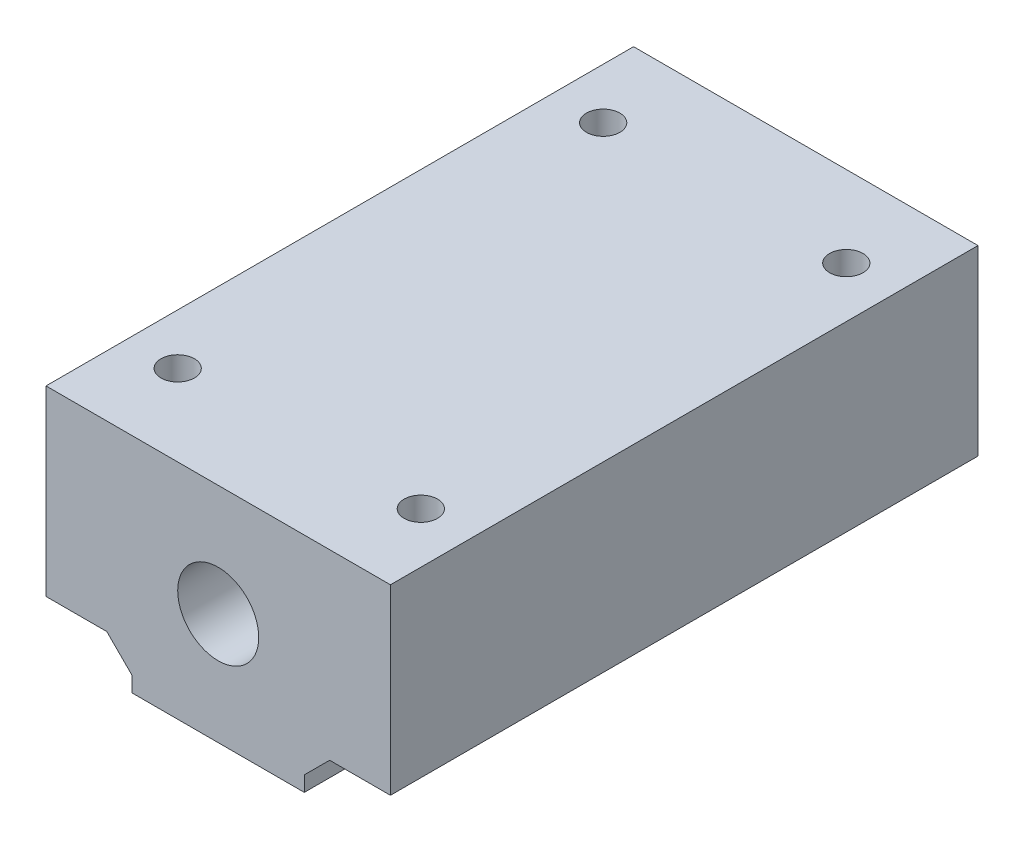
ISO-10303-21;
HEADER;
FILE_DESCRIPTION(('STEP AP214'),'2;1');
FILE_NAME('part.step','',(''),(''),'','','');
FILE_SCHEMA(('AUTOMOTIVE_DESIGN { 1 0 10303 214 1 1 1 1 }'));
ENDSEC;
DATA;
#1=APPLICATION_CONTEXT('core data for automotive mechanical design processes');
#2=APPLICATION_PROTOCOL_DEFINITION('international standard','automotive_design',2000,#1);
#3=PRODUCT_CONTEXT('',#1,'mechanical');
#4=PRODUCT('Part','Part','',(#3));
#5=PRODUCT_RELATED_PRODUCT_CATEGORY('part','',(#4));
#6=PRODUCT_DEFINITION_FORMATION('','',#4);
#7=PRODUCT_DEFINITION_CONTEXT('part definition',#1,'design');
#8=PRODUCT_DEFINITION('design','',#6,#7);
#9=PRODUCT_DEFINITION_SHAPE('','',#8);
#10=(LENGTH_UNIT() NAMED_UNIT(*) SI_UNIT(.MILLI.,.METRE.));
#11=(NAMED_UNIT(*) PLANE_ANGLE_UNIT() SI_UNIT($,.RADIAN.));
#12=(NAMED_UNIT(*) SI_UNIT($,.STERADIAN.) SOLID_ANGLE_UNIT());
#13=UNCERTAINTY_MEASURE_WITH_UNIT(LENGTH_MEASURE(1.E-05),#10,'distance_accuracy_value','');
#14=(GEOMETRIC_REPRESENTATION_CONTEXT(3) GLOBAL_UNCERTAINTY_ASSIGNED_CONTEXT((#13)) GLOBAL_UNIT_ASSIGNED_CONTEXT((#10,
#11,#12)) REPRESENTATION_CONTEXT('',''));
#15=CARTESIAN_POINT('',(0.,0.,0.));
#16=DIRECTION('',(0.,0.,1.));
#17=DIRECTION('',(1.,0.,0.));
#18=AXIS2_PLACEMENT_3D('',#15,#16,#17);
#19=CARTESIAN_POINT('',(-8.5,4.,58.));
#20=DIRECTION('',(0.,0.,1.));
#21=DIRECTION('',(1.,0.,0.));
#22=AXIS2_PLACEMENT_3D('',#19,#20,#21);
#23=PLANE('',#22);
#24=DIRECTION('',(0.,-1.,0.));
#25=VECTOR('',#24,1.);
#26=CARTESIAN_POINT('',(-8.5,0.,58.));
#27=LINE('',#26,#25);
#28=CARTESIAN_POINT('',(-8.5,1.49999999999999,58.));
#29=VERTEX_POINT('',#28);
#30=CARTESIAN_POINT('',(-8.5,0.,58.));
#31=VERTEX_POINT('',#30);
#32=EDGE_CURVE('E171',#29,#31,#27,.T.);
#33=ORIENTED_EDGE('',*,*,#32,.T.);
#34=DIRECTION('',(1.,0.,0.));
#35=VECTOR('',#34,1.);
#36=CARTESIAN_POINT('',(8.5,0.,58.));
#37=LINE('',#36,#35);
#38=CARTESIAN_POINT('',(8.5,0.,58.));
#39=VERTEX_POINT('',#38);
#40=EDGE_CURVE('E205',#31,#39,#37,.T.);
#41=ORIENTED_EDGE('',*,*,#40,.T.);
#42=DIRECTION('',(0.,1.,0.));
#43=VECTOR('',#42,1.);
#44=CARTESIAN_POINT('',(8.5,0.,58.));
#45=LINE('',#44,#43);
#46=CARTESIAN_POINT('',(8.5,1.49999999999999,58.));
#47=VERTEX_POINT('',#46);
#48=EDGE_CURVE('E203',#39,#47,#45,.T.);
#49=ORIENTED_EDGE('',*,*,#48,.T.);
#50=DIRECTION('',(0.707106781186547,0.707106781186548,0.));
#51=VECTOR('',#50,1.);
#52=CARTESIAN_POINT('',(8.5,1.49999999999999,58.));
#53=LINE('',#52,#51);
#54=CARTESIAN_POINT('',(11.,3.99999999999999,58.));
#55=VERTEX_POINT('',#54);
#56=EDGE_CURVE('E201',#47,#55,#53,.T.);
#57=ORIENTED_EDGE('',*,*,#56,.T.);
#58=DIRECTION('',(1.,0.,0.));
#59=VECTOR('',#58,1.);
#60=CARTESIAN_POINT('',(11.,3.99999999999999,58.));
#61=LINE('',#60,#59);
#62=CARTESIAN_POINT('',(17.,3.99999999999999,58.));
#63=VERTEX_POINT('',#62);
#64=EDGE_CURVE('E199',#55,#63,#61,.T.);
#65=ORIENTED_EDGE('',*,*,#64,.T.);
#66=DIRECTION('',(0.,1.,0.));
#67=VECTOR('',#66,1.);
#68=CARTESIAN_POINT('',(17.,3.99999999999999,58.));
#69=LINE('',#68,#67);
#70=CARTESIAN_POINT('',(17.,22.,58.));
#71=VERTEX_POINT('',#70);
#72=EDGE_CURVE('E197',#63,#71,#69,.T.);
#73=ORIENTED_EDGE('',*,*,#72,.T.);
#74=DIRECTION('',(-1.,0.,0.));
#75=VECTOR('',#74,1.);
#76=CARTESIAN_POINT('',(-17.,22.,58.));
#77=LINE('',#76,#75);
#78=CARTESIAN_POINT('',(-17.,22.,58.));
#79=VERTEX_POINT('',#78);
#80=EDGE_CURVE('E195',#71,#79,#77,.T.);
#81=ORIENTED_EDGE('',*,*,#80,.T.);
#82=DIRECTION('',(0.,-1.,0.));
#83=VECTOR('',#82,1.);
#84=CARTESIAN_POINT('',(-17.,3.99999999999999,58.));
#85=LINE('',#84,#83);
#86=CARTESIAN_POINT('',(-17.,3.99999999999999,58.));
#87=VERTEX_POINT('',#86);
#88=EDGE_CURVE('E193',#79,#87,#85,.T.);
#89=ORIENTED_EDGE('',*,*,#88,.T.);
#90=DIRECTION('',(1.,0.,0.));
#91=VECTOR('',#90,1.);
#92=CARTESIAN_POINT('',(-11.,3.99999999999999,58.));
#93=LINE('',#92,#91);
#94=CARTESIAN_POINT('',(-11.,3.99999999999999,58.));
#95=VERTEX_POINT('',#94);
#96=EDGE_CURVE('E166',#87,#95,#93,.T.);
#97=ORIENTED_EDGE('',*,*,#96,.T.);
#98=DIRECTION('',(0.707106781186547,-0.707106781186548,0.));
#99=VECTOR('',#98,1.);
#100=CARTESIAN_POINT('',(-8.5,1.49999999999999,58.));
#101=LINE('',#100,#99);
#102=EDGE_CURVE('E149',#95,#29,#101,.T.);
#103=ORIENTED_EDGE('',*,*,#102,.T.);
#104=EDGE_LOOP('',(#33,#41,#49,#57,#65,#73,#81,#89,#97,#103));
#105=FACE_BOUND('',#104,.T.);
#106=CARTESIAN_POINT('',(0.,11.,58.));
#107=DIRECTION('',(0.,0.,1.));
#108=DIRECTION('',(1.,0.,0.));
#109=AXIS2_PLACEMENT_3D('',#106,#107,#108);
#110=CIRCLE('',#109,4.);
#111=CARTESIAN_POINT('',(-4.,11.,58.));
#112=VERTEX_POINT('',#111);
#113=EDGE_CURVE('E190',#112,#112,#110,.T.);
#114=ORIENTED_EDGE('',*,*,#113,.F.);
#115=EDGE_LOOP('',(#114));
#116=FACE_BOUND('',#115,.T.);
#117=ADVANCED_FACE('F35',(#105,#116),#23,.T.);
#118=CARTESIAN_POINT('',(-8.5,4.,0.));
#119=DIRECTION('',(0.,0.,1.));
#120=DIRECTION('',(1.,0.,0.));
#121=AXIS2_PLACEMENT_3D('',#118,#119,#120);
#122=PLANE('',#121);
#123=DIRECTION('',(0.,-1.,0.));
#124=VECTOR('',#123,1.);
#125=CARTESIAN_POINT('',(-8.5,0.,0.));
#126=LINE('',#125,#124);
#127=CARTESIAN_POINT('',(-8.5,1.49999999999999,0.));
#128=VERTEX_POINT('',#127);
#129=CARTESIAN_POINT('',(-8.5,0.,0.));
#130=VERTEX_POINT('',#129);
#131=EDGE_CURVE('E189',#128,#130,#126,.T.);
#132=ORIENTED_EDGE('',*,*,#131,.F.);
#133=DIRECTION('',(0.707106781186547,-0.707106781186548,0.));
#134=VECTOR('',#133,1.);
#135=CARTESIAN_POINT('',(-8.5,1.49999999999999,0.));
#136=LINE('',#135,#134);
#137=CARTESIAN_POINT('',(-11.,3.99999999999999,0.));
#138=VERTEX_POINT('',#137);
#139=EDGE_CURVE('E169',#138,#128,#136,.T.);
#140=ORIENTED_EDGE('',*,*,#139,.F.);
#141=DIRECTION('',(1.,0.,0.));
#142=VECTOR('',#141,1.);
#143=CARTESIAN_POINT('',(-11.,3.99999999999999,0.));
#144=LINE('',#143,#142);
#145=CARTESIAN_POINT('',(-17.,3.99999999999999,0.));
#146=VERTEX_POINT('',#145);
#147=EDGE_CURVE('E172',#146,#138,#144,.T.);
#148=ORIENTED_EDGE('',*,*,#147,.F.);
#149=DIRECTION('',(0.,-1.,0.));
#150=VECTOR('',#149,1.);
#151=CARTESIAN_POINT('',(-17.,3.99999999999999,0.));
#152=LINE('',#151,#150);
#153=CARTESIAN_POINT('',(-17.,22.,0.));
#154=VERTEX_POINT('',#153);
#155=EDGE_CURVE('E174',#154,#146,#152,.T.);
#156=ORIENTED_EDGE('',*,*,#155,.F.);
#157=DIRECTION('',(-1.,0.,0.));
#158=VECTOR('',#157,1.);
#159=CARTESIAN_POINT('',(-17.,22.,0.));
#160=LINE('',#159,#158);
#161=CARTESIAN_POINT('',(17.,22.,0.));
#162=VERTEX_POINT('',#161);
#163=EDGE_CURVE('E176',#162,#154,#160,.T.);
#164=ORIENTED_EDGE('',*,*,#163,.F.);
#165=DIRECTION('',(0.,1.,0.));
#166=VECTOR('',#165,1.);
#167=CARTESIAN_POINT('',(17.,3.99999999999999,0.));
#168=LINE('',#167,#166);
#169=CARTESIAN_POINT('',(17.,3.99999999999999,0.));
#170=VERTEX_POINT('',#169);
#171=EDGE_CURVE('E178',#170,#162,#168,.T.);
#172=ORIENTED_EDGE('',*,*,#171,.F.);
#173=DIRECTION('',(1.,0.,0.));
#174=VECTOR('',#173,1.);
#175=CARTESIAN_POINT('',(11.,3.99999999999999,0.));
#176=LINE('',#175,#174);
#177=CARTESIAN_POINT('',(11.,3.99999999999999,0.));
#178=VERTEX_POINT('',#177);
#179=EDGE_CURVE('E180',#178,#170,#176,.T.);
#180=ORIENTED_EDGE('',*,*,#179,.F.);
#181=DIRECTION('',(0.707106781186547,0.707106781186548,0.));
#182=VECTOR('',#181,1.);
#183=CARTESIAN_POINT('',(8.5,1.49999999999999,0.));
#184=LINE('',#183,#182);
#185=CARTESIAN_POINT('',(8.5,1.49999999999999,0.));
#186=VERTEX_POINT('',#185);
#187=EDGE_CURVE('E182',#186,#178,#184,.T.);
#188=ORIENTED_EDGE('',*,*,#187,.F.);
#189=DIRECTION('',(0.,1.,0.));
#190=VECTOR('',#189,1.);
#191=CARTESIAN_POINT('',(8.5,0.,0.));
#192=LINE('',#191,#190);
#193=CARTESIAN_POINT('',(8.5,0.,0.));
#194=VERTEX_POINT('',#193);
#195=EDGE_CURVE('E185',#194,#186,#192,.T.);
#196=ORIENTED_EDGE('',*,*,#195,.F.);
#197=DIRECTION('',(1.,0.,0.));
#198=VECTOR('',#197,1.);
#199=CARTESIAN_POINT('',(8.5,0.,0.));
#200=LINE('',#199,#198);
#201=EDGE_CURVE('E187',#130,#194,#200,.T.);
#202=ORIENTED_EDGE('',*,*,#201,.F.);
#203=EDGE_LOOP('',(#132,#140,#148,#156,#164,#172,#180,#188,#196,#202));
#204=FACE_BOUND('',#203,.T.);
#205=CARTESIAN_POINT('',(0.,11.,0.));
#206=DIRECTION('',(0.,0.,1.));
#207=DIRECTION('',(1.,0.,0.));
#208=AXIS2_PLACEMENT_3D('',#205,#206,#207);
#209=CIRCLE('',#208,4.);
#210=CARTESIAN_POINT('',(-4.,11.,0.));
#211=VERTEX_POINT('',#210);
#212=EDGE_CURVE('E209',#211,#211,#209,.T.);
#213=ORIENTED_EDGE('',*,*,#212,.T.);
#214=EDGE_LOOP('',(#213));
#215=FACE_BOUND('',#214,.T.);
#216=ADVANCED_FACE('F264',(#204,#215),#122,.F.);
#217=CARTESIAN_POINT('',(-8.5,0.,58.));
#218=DIRECTION('',(1.,0.,0.));
#219=DIRECTION('',(0.,0.,-1.));
#220=AXIS2_PLACEMENT_3D('',#217,#218,#219);
#221=PLANE('',#220);
#222=ORIENTED_EDGE('',*,*,#131,.T.);
#223=DIRECTION('',(0.,0.,-1.));
#224=VECTOR('',#223,1.);
#225=CARTESIAN_POINT('',(-8.5,0.,58.));
#226=LINE('',#225,#224);
#227=EDGE_CURVE('E289',#31,#130,#226,.T.);
#228=ORIENTED_EDGE('',*,*,#227,.F.);
#229=ORIENTED_EDGE('',*,*,#32,.F.);
#230=DIRECTION('',(0.,0.,-1.));
#231=VECTOR('',#230,1.);
#232=CARTESIAN_POINT('',(-8.5,1.49999999999999,58.));
#233=LINE('',#232,#231);
#234=EDGE_CURVE('E157',#29,#128,#233,.T.);
#235=ORIENTED_EDGE('',*,*,#234,.T.);
#236=EDGE_LOOP('',(#222,#228,#229,#235));
#237=FACE_BOUND('',#236,.T.);
#238=ADVANCED_FACE('F37',(#237),#221,.F.);
#239=CARTESIAN_POINT('',(8.5,0.,58.));
#240=DIRECTION('',(0.,1.,0.));
#241=DIRECTION('',(0.,0.,1.));
#242=AXIS2_PLACEMENT_3D('',#239,#240,#241);
#243=PLANE('',#242);
#244=ORIENTED_EDGE('',*,*,#201,.T.);
#245=DIRECTION('',(0.,0.,-1.));
#246=VECTOR('',#245,1.);
#247=CARTESIAN_POINT('',(8.5,0.,58.));
#248=LINE('',#247,#246);
#249=EDGE_CURVE('E286',#39,#194,#248,.T.);
#250=ORIENTED_EDGE('',*,*,#249,.F.);
#251=ORIENTED_EDGE('',*,*,#40,.F.);
#252=ORIENTED_EDGE('',*,*,#227,.T.);
#253=EDGE_LOOP('',(#244,#250,#251,#252));
#254=FACE_BOUND('',#253,.T.);
#255=ADVANCED_FACE('F333',(#254),#243,.F.);
#256=CARTESIAN_POINT('',(8.5,0.,58.));
#257=DIRECTION('',(-1.,0.,0.));
#258=DIRECTION('',(0.,0.,1.));
#259=AXIS2_PLACEMENT_3D('',#256,#257,#258);
#260=PLANE('',#259);
#261=ORIENTED_EDGE('',*,*,#195,.T.);
#262=DIRECTION('',(0.,0.,-1.));
#263=VECTOR('',#262,1.);
#264=CARTESIAN_POINT('',(8.5,1.49999999999999,58.));
#265=LINE('',#264,#263);
#266=EDGE_CURVE('E282',#47,#186,#265,.T.);
#267=ORIENTED_EDGE('',*,*,#266,.F.);
#268=ORIENTED_EDGE('',*,*,#48,.F.);
#269=ORIENTED_EDGE('',*,*,#249,.T.);
#270=EDGE_LOOP('',(#261,#267,#268,#269));
#271=FACE_BOUND('',#270,.T.);
#272=ADVANCED_FACE('F330',(#271),#260,.F.);
#273=CARTESIAN_POINT('',(8.5,1.49999999999999,58.));
#274=DIRECTION('',(-0.707106781186548,0.707106781186547,0.));
#275=DIRECTION('',(-0.707106781186547,-0.707106781186548,0.));
#276=AXIS2_PLACEMENT_3D('',#273,#274,#275);
#277=PLANE('',#276);
#278=DIRECTION('',(0.,0.,-1.));
#279=VECTOR('',#278,1.);
#280=CARTESIAN_POINT('',(11.,3.99999999999999,58.));
#281=LINE('',#280,#279);
#282=CARTESIAN_POINT('',(11.,4.,48.6875595251593));
#283=VERTEX_POINT('',#282);
#284=CARTESIAN_POINT('',(11.,4.,9.31244047484066));
#285=VERTEX_POINT('',#284);
#286=EDGE_CURVE('E283',#283,#285,#281,.T.);
#287=ORIENTED_EDGE('',*,*,#286,.F.);
#288=CARTESIAN_POINT('',(12.,4.99999999999999,50.));
#289=DIRECTION('',(-0.707106781186548,0.707106781186547,0.));
#290=DIRECTION('',(0.707106781186547,0.707106781186548,0.));
#291=AXIS2_PLACEMENT_3D('',#288,#289,#290);
#292=ELLIPSE('',#291,2.3334523779156,1.64999999999999);
#293=CARTESIAN_POINT('',(11.,4.,51.3124404748407));
#294=VERTEX_POINT('',#293);
#295=EDGE_CURVE('E55',#283,#294,#292,.T.);
#296=ORIENTED_EDGE('',*,*,#295,.T.);
#297=EDGE_CURVE('E279',#55,#294,#281,.T.);
#298=ORIENTED_EDGE('',*,*,#297,.F.);
#299=ORIENTED_EDGE('',*,*,#56,.F.);
#300=ORIENTED_EDGE('',*,*,#266,.T.);
#301=ORIENTED_EDGE('',*,*,#187,.T.);
#302=CARTESIAN_POINT('',(11.,4.,6.68755952515934));
#303=VERTEX_POINT('',#302);
#304=EDGE_CURVE('E276',#303,#178,#281,.T.);
#305=ORIENTED_EDGE('',*,*,#304,.F.);
#306=CARTESIAN_POINT('',(12.,4.99999999999999,8.));
#307=DIRECTION('',(-0.707106781186548,0.707106781186547,0.));
#308=DIRECTION('',(0.707106781186547,0.707106781186548,0.));
#309=AXIS2_PLACEMENT_3D('',#306,#307,#308);
#310=ELLIPSE('',#309,2.3334523779156,1.64999999999999);
#311=EDGE_CURVE('E219',#303,#285,#310,.T.);
#312=ORIENTED_EDGE('',*,*,#311,.T.);
#313=EDGE_LOOP('',(#287,#296,#298,#299,#300,#301,#305,#312));
#314=FACE_BOUND('',#313,.T.);
#315=ADVANCED_FACE('F326',(#314),#277,.F.);
#316=CARTESIAN_POINT('',(11.,3.99999999999999,58.));
#317=DIRECTION('',(0.,1.,0.));
#318=DIRECTION('',(-1.,0.,0.));
#319=AXIS2_PLACEMENT_3D('',#316,#317,#318);
#320=PLANE('',#319);
#321=ORIENTED_EDGE('',*,*,#297,.T.);
#322=CARTESIAN_POINT('',(12.,4.,50.));
#323=DIRECTION('',(0.,1.,0.));
#324=DIRECTION('',(-1.,0.,0.));
#325=AXIS2_PLACEMENT_3D('',#322,#323,#324);
#326=CIRCLE('',#325,1.64999999999999);
#327=EDGE_CURVE('E229',#294,#283,#326,.T.);
#328=ORIENTED_EDGE('',*,*,#327,.T.);
#329=ORIENTED_EDGE('',*,*,#286,.T.);
#330=CARTESIAN_POINT('',(12.,4.,8.));
#331=DIRECTION('',(0.,1.,0.));
#332=DIRECTION('',(-1.,0.,0.));
#333=AXIS2_PLACEMENT_3D('',#330,#331,#332);
#334=CIRCLE('',#333,1.64999999999999);
#335=EDGE_CURVE('E222',#285,#303,#334,.T.);
#336=ORIENTED_EDGE('',*,*,#335,.T.);
#337=ORIENTED_EDGE('',*,*,#304,.T.);
#338=ORIENTED_EDGE('',*,*,#179,.T.);
#339=DIRECTION('',(0.,0.,-1.));
#340=VECTOR('',#339,1.);
#341=CARTESIAN_POINT('',(17.,3.99999999999999,58.));
#342=LINE('',#341,#340);
#343=EDGE_CURVE('E274',#63,#170,#342,.T.);
#344=ORIENTED_EDGE('',*,*,#343,.F.);
#345=ORIENTED_EDGE('',*,*,#64,.F.);
#346=EDGE_LOOP('',(#321,#328,#329,#336,#337,#338,#344,#345));
#347=FACE_BOUND('',#346,.T.);
#348=ADVANCED_FACE('F323',(#347),#320,.F.);
#349=CARTESIAN_POINT('',(17.,3.99999999999999,58.));
#350=DIRECTION('',(-1.,0.,0.));
#351=DIRECTION('',(0.,0.,1.));
#352=AXIS2_PLACEMENT_3D('',#349,#350,#351);
#353=PLANE('',#352);
#354=ORIENTED_EDGE('',*,*,#171,.T.);
#355=DIRECTION('',(0.,0.,-1.));
#356=VECTOR('',#355,1.);
#357=CARTESIAN_POINT('',(17.,22.,58.));
#358=LINE('',#357,#356);
#359=EDGE_CURVE('E256',#71,#162,#358,.T.);
#360=ORIENTED_EDGE('',*,*,#359,.F.);
#361=ORIENTED_EDGE('',*,*,#72,.F.);
#362=ORIENTED_EDGE('',*,*,#343,.T.);
#363=EDGE_LOOP('',(#354,#360,#361,#362));
#364=FACE_BOUND('',#363,.T.);
#365=ADVANCED_FACE('F241',(#364),#353,.F.);
#366=CARTESIAN_POINT('',(-17.,22.,58.));
#367=DIRECTION('',(0.,-1.,0.));
#368=DIRECTION('',(0.,0.,-1.));
#369=AXIS2_PLACEMENT_3D('',#366,#367,#368);
#370=PLANE('',#369);
#371=CARTESIAN_POINT('',(-12.,22.,50.));
#372=DIRECTION('',(0.,1.,0.));
#373=DIRECTION('',(0.,0.,1.));
#374=AXIS2_PLACEMENT_3D('',#371,#372,#373);
#375=CIRCLE('',#374,1.64999999999999);
#376=CARTESIAN_POINT('',(-12.,22.,51.65));
#377=VERTEX_POINT('',#376);
#378=EDGE_CURVE('E145',#377,#377,#375,.T.);
#379=ORIENTED_EDGE('',*,*,#378,.F.);
#380=EDGE_LOOP('',(#379));
#381=FACE_BOUND('',#380,.T.);
#382=CARTESIAN_POINT('',(12.,22.,50.));
#383=DIRECTION('',(0.,1.,0.));
#384=DIRECTION('',(0.,0.,1.));
#385=AXIS2_PLACEMENT_3D('',#382,#383,#384);
#386=CIRCLE('',#385,1.64999999999999);
#387=CARTESIAN_POINT('',(12.,22.,51.65));
#388=VERTEX_POINT('',#387);
#389=EDGE_CURVE('E144',#388,#388,#386,.T.);
#390=ORIENTED_EDGE('',*,*,#389,.F.);
#391=EDGE_LOOP('',(#390));
#392=FACE_BOUND('',#391,.T.);
#393=CARTESIAN_POINT('',(12.,22.,8.));
#394=DIRECTION('',(0.,1.,0.));
#395=DIRECTION('',(0.,0.,1.));
#396=AXIS2_PLACEMENT_3D('',#393,#394,#395);
#397=CIRCLE('',#396,1.64999999999999);
#398=CARTESIAN_POINT('',(12.,22.,9.64999999999999));
#399=VERTEX_POINT('',#398);
#400=EDGE_CURVE('E225',#399,#399,#397,.T.);
#401=ORIENTED_EDGE('',*,*,#400,.F.);
#402=EDGE_LOOP('',(#401));
#403=FACE_BOUND('',#402,.T.);
#404=CARTESIAN_POINT('',(-12.,22.,8.));
#405=DIRECTION('',(0.,1.,0.));
#406=DIRECTION('',(0.,0.,1.));
#407=AXIS2_PLACEMENT_3D('',#404,#405,#406);
#408=CIRCLE('',#407,1.64999999999999);
#409=CARTESIAN_POINT('',(-12.,22.,9.64999999999999));
#410=VERTEX_POINT('',#409);
#411=EDGE_CURVE('E216',#410,#410,#408,.T.);
#412=ORIENTED_EDGE('',*,*,#411,.F.);
#413=EDGE_LOOP('',(#412));
#414=FACE_BOUND('',#413,.T.);
#415=ORIENTED_EDGE('',*,*,#163,.T.);
#416=DIRECTION('',(0.,0.,-1.));
#417=VECTOR('',#416,1.);
#418=CARTESIAN_POINT('',(-17.,22.,58.));
#419=LINE('',#418,#417);
#420=EDGE_CURVE('E154',#79,#154,#419,.T.);
#421=ORIENTED_EDGE('',*,*,#420,.F.);
#422=ORIENTED_EDGE('',*,*,#80,.F.);
#423=ORIENTED_EDGE('',*,*,#359,.T.);
#424=EDGE_LOOP('',(#415,#421,#422,#423));
#425=FACE_BOUND('',#424,.T.);
#426=ADVANCED_FACE('F237',(#381,#392,#403,#414,#425),#370,.F.);
#427=CARTESIAN_POINT('',(-17.,3.99999999999999,58.));
#428=DIRECTION('',(1.,0.,0.));
#429=DIRECTION('',(0.,0.,-1.));
#430=AXIS2_PLACEMENT_3D('',#427,#428,#429);
#431=PLANE('',#430);
#432=ORIENTED_EDGE('',*,*,#155,.T.);
#433=DIRECTION('',(0.,0.,-1.));
#434=VECTOR('',#433,1.);
#435=CARTESIAN_POINT('',(-17.,3.99999999999999,58.));
#436=LINE('',#435,#434);
#437=EDGE_CURVE('E150',#87,#146,#436,.T.);
#438=ORIENTED_EDGE('',*,*,#437,.F.);
#439=ORIENTED_EDGE('',*,*,#88,.F.);
#440=ORIENTED_EDGE('',*,*,#420,.T.);
#441=EDGE_LOOP('',(#432,#438,#439,#440));
#442=FACE_BOUND('',#441,.T.);
#443=ADVANCED_FACE('F240',(#442),#431,.F.);
#444=CARTESIAN_POINT('',(-11.,3.99999999999999,58.));
#445=DIRECTION('',(0.,1.,0.));
#446=DIRECTION('',(-1.,0.,0.));
#447=AXIS2_PLACEMENT_3D('',#444,#445,#446);
#448=PLANE('',#447);
#449=DIRECTION('',(0.,0.,-1.));
#450=VECTOR('',#449,1.);
#451=CARTESIAN_POINT('',(-11.,3.99999999999999,58.));
#452=LINE('',#451,#450);
#453=CARTESIAN_POINT('',(-11.,3.99999999999999,48.6875595251593));
#454=VERTEX_POINT('',#453);
#455=CARTESIAN_POINT('',(-11.,3.99999999999999,9.31244047484067));
#456=VERTEX_POINT('',#455);
#457=EDGE_CURVE('E143',#454,#456,#452,.T.);
#458=ORIENTED_EDGE('',*,*,#457,.F.);
#459=CARTESIAN_POINT('',(-12.,4.,50.));
#460=DIRECTION('',(0.,1.,0.));
#461=DIRECTION('',(-1.,0.,0.));
#462=AXIS2_PLACEMENT_3D('',#459,#460,#461);
#463=CIRCLE('',#462,1.64999999999999);
#464=CARTESIAN_POINT('',(-11.,3.99999999999999,51.3124404748407));
#465=VERTEX_POINT('',#464);
#466=EDGE_CURVE('E49',#454,#465,#463,.T.);
#467=ORIENTED_EDGE('',*,*,#466,.T.);
#468=EDGE_CURVE('E140',#95,#465,#452,.T.);
#469=ORIENTED_EDGE('',*,*,#468,.F.);
#470=ORIENTED_EDGE('',*,*,#96,.F.);
#471=ORIENTED_EDGE('',*,*,#437,.T.);
#472=ORIENTED_EDGE('',*,*,#147,.T.);
#473=CARTESIAN_POINT('',(-11.,3.99999999999999,6.68755952515936));
#474=VERTEX_POINT('',#473);
#475=EDGE_CURVE('E152',#474,#138,#452,.T.);
#476=ORIENTED_EDGE('',*,*,#475,.F.);
#477=CARTESIAN_POINT('',(-12.,4.,8.));
#478=DIRECTION('',(0.,1.,0.));
#479=DIRECTION('',(-1.,0.,0.));
#480=AXIS2_PLACEMENT_3D('',#477,#478,#479);
#481=CIRCLE('',#480,1.64999999999999);
#482=EDGE_CURVE('E212',#474,#456,#481,.T.);
#483=ORIENTED_EDGE('',*,*,#482,.T.);
#484=EDGE_LOOP('',(#458,#467,#469,#470,#471,#472,#476,#483));
#485=FACE_BOUND('',#484,.T.);
#486=ADVANCED_FACE('F138',(#485),#448,.F.);
#487=CARTESIAN_POINT('',(-8.5,1.49999999999999,58.));
#488=DIRECTION('',(0.707106781186548,0.707106781186547,0.));
#489=DIRECTION('',(-0.707106781186547,0.707106781186548,0.));
#490=AXIS2_PLACEMENT_3D('',#487,#488,#489);
#491=PLANE('',#490);
#492=ORIENTED_EDGE('',*,*,#468,.T.);
#493=CARTESIAN_POINT('',(-12.,4.99999999999999,50.));
#494=DIRECTION('',(0.707106781186548,0.707106781186547,0.));
#495=DIRECTION('',(-0.707106781186547,0.707106781186548,0.));
#496=AXIS2_PLACEMENT_3D('',#493,#494,#495);
#497=ELLIPSE('',#496,2.3334523779156,1.64999999999999);
#498=EDGE_CURVE('E11',#465,#454,#497,.T.);
#499=ORIENTED_EDGE('',*,*,#498,.T.);
#500=ORIENTED_EDGE('',*,*,#457,.T.);
#501=CARTESIAN_POINT('',(-12.,4.99999999999999,8.));
#502=DIRECTION('',(0.707106781186548,0.707106781186547,0.));
#503=DIRECTION('',(-0.707106781186547,0.707106781186548,0.));
#504=AXIS2_PLACEMENT_3D('',#501,#502,#503);
#505=ELLIPSE('',#504,2.3334523779156,1.64999999999999);
#506=EDGE_CURVE('E43',#456,#474,#505,.T.);
#507=ORIENTED_EDGE('',*,*,#506,.T.);
#508=ORIENTED_EDGE('',*,*,#475,.T.);
#509=ORIENTED_EDGE('',*,*,#139,.T.);
#510=ORIENTED_EDGE('',*,*,#234,.F.);
#511=ORIENTED_EDGE('',*,*,#102,.F.);
#512=EDGE_LOOP('',(#492,#499,#500,#507,#508,#509,#510,#511));
#513=FACE_BOUND('',#512,.T.);
#514=ADVANCED_FACE('F147',(#513),#491,.F.);
#515=CARTESIAN_POINT('',(0.,11.,58.));
#516=DIRECTION('',(0.,0.,-1.));
#517=DIRECTION('',(-1.,0.,0.));
#518=AXIS2_PLACEMENT_3D('',#515,#516,#517);
#519=CYLINDRICAL_SURFACE('',#518,4.);
#520=CARTESIAN_POINT('',(-4.,11.,58.));
#521=CARTESIAN_POINT('',(-4.,11.,57.3958333333333));
#522=CARTESIAN_POINT('',(-4.,11.,56.7916666666667));
#523=CARTESIAN_POINT('',(-4.,11.,55.5833333333333));
#524=CARTESIAN_POINT('',(-4.,11.,54.9791666666667));
#525=CARTESIAN_POINT('',(-4.,11.,53.7708333333333));
#526=CARTESIAN_POINT('',(-4.,11.,53.1666666666667));
#527=CARTESIAN_POINT('',(-4.,11.,51.9583333333333));
#528=CARTESIAN_POINT('',(-4.,11.,51.3541666666667));
#529=CARTESIAN_POINT('',(-4.,11.,50.1458333333333));
#530=CARTESIAN_POINT('',(-4.,11.,49.5416666666667));
#531=CARTESIAN_POINT('',(-4.,11.,48.3333333333333));
#532=CARTESIAN_POINT('',(-4.,11.,47.7291666666667));
#533=CARTESIAN_POINT('',(-4.,11.,46.5208333333333));
#534=CARTESIAN_POINT('',(-4.,11.,45.9166666666667));
#535=CARTESIAN_POINT('',(-4.,11.,44.7083333333333));
#536=CARTESIAN_POINT('',(-4.,11.,44.1041666666667));
#537=CARTESIAN_POINT('',(-4.,11.,42.8958333333333));
#538=CARTESIAN_POINT('',(-4.,11.,42.2916666666667));
#539=CARTESIAN_POINT('',(-4.,11.,41.0833333333333));
#540=CARTESIAN_POINT('',(-4.,11.,40.4791666666667));
#541=CARTESIAN_POINT('',(-4.,11.,39.2708333333333));
#542=CARTESIAN_POINT('',(-4.,11.,38.6666666666667));
#543=CARTESIAN_POINT('',(-4.,11.,37.4583333333333));
#544=CARTESIAN_POINT('',(-4.,11.,36.8541666666667));
#545=CARTESIAN_POINT('',(-4.,11.,35.6458333333333));
#546=CARTESIAN_POINT('',(-4.,11.,35.0416666666667));
#547=CARTESIAN_POINT('',(-4.,11.,33.8333333333333));
#548=CARTESIAN_POINT('',(-4.,11.,33.2291666666667));
#549=CARTESIAN_POINT('',(-4.,11.,32.0208333333333));
#550=CARTESIAN_POINT('',(-4.,11.,31.4166666666667));
#551=CARTESIAN_POINT('',(-4.,11.,30.2083333333333));
#552=CARTESIAN_POINT('',(-4.,11.,29.6041666666667));
#553=CARTESIAN_POINT('',(-4.,11.,28.3958333333333));
#554=CARTESIAN_POINT('',(-4.,11.,27.7916666666667));
#555=CARTESIAN_POINT('',(-4.,11.,26.5833333333333));
#556=CARTESIAN_POINT('',(-4.,11.,25.9791666666667));
#557=CARTESIAN_POINT('',(-4.,11.,24.7708333333333));
#558=CARTESIAN_POINT('',(-4.,11.,24.1666666666667));
#559=CARTESIAN_POINT('',(-4.,11.,22.9583333333333));
#560=CARTESIAN_POINT('',(-4.,11.,22.3541666666667));
#561=CARTESIAN_POINT('',(-4.,11.,21.1458333333333));
#562=CARTESIAN_POINT('',(-4.,11.,20.5416666666667));
#563=CARTESIAN_POINT('',(-4.,11.,19.3333333333333));
#564=CARTESIAN_POINT('',(-4.,11.,18.7291666666667));
#565=CARTESIAN_POINT('',(-4.,11.,17.5208333333333));
#566=CARTESIAN_POINT('',(-4.,11.,16.9166666666667));
#567=CARTESIAN_POINT('',(-4.,11.,15.7083333333333));
#568=CARTESIAN_POINT('',(-4.,11.,15.1041666666667));
#569=CARTESIAN_POINT('',(-4.,11.,13.8958333333333));
#570=CARTESIAN_POINT('',(-4.,11.,13.2916666666667));
#571=CARTESIAN_POINT('',(-4.,11.,12.0833333333333));
#572=CARTESIAN_POINT('',(-4.,11.,11.4791666666667));
#573=CARTESIAN_POINT('',(-4.,11.,10.2708333333333));
#574=CARTESIAN_POINT('',(-4.,11.,9.66666666666667));
#575=CARTESIAN_POINT('',(-4.,11.,8.45833333333333));
#576=CARTESIAN_POINT('',(-4.,11.,7.85416666666667));
#577=CARTESIAN_POINT('',(-4.,11.,6.64583333333333));
#578=CARTESIAN_POINT('',(-4.,11.,6.04166666666667));
#579=CARTESIAN_POINT('',(-4.,11.,4.83333333333333));
#580=CARTESIAN_POINT('',(-4.,11.,4.22916666666667));
#581=CARTESIAN_POINT('',(-4.,11.,3.02083333333334));
#582=CARTESIAN_POINT('',(-4.,11.,2.41666666666667));
#583=CARTESIAN_POINT('',(-4.,11.,1.20833333333333));
#584=CARTESIAN_POINT('',(-4.,11.,0.604166666666666));
#585=CARTESIAN_POINT('',(-4.,11.,0.));
#586=B_SPLINE_CURVE_WITH_KNOTS('',3,(#520,#521,#522,#523,#524,#525,#526,#527,#528,#529,#530,
#531,#532,#533,#534,#535,#536,#537,#538,#539,#540,#541,#542,#543,#544,#545,#546,#547,#548,#549,
#550,#551,#552,#553,#554,#555,#556,#557,#558,#559,#560,#561,#562,#563,#564,#565,#566,#567,#568,
#569,#570,#571,#572,#573,#574,#575,#576,#577,#578,#579,#580,#581,#582,#583,#584,#585),
.UNSPECIFIED.,.F.,.F.,(4,2,2,2,2,2,2,2,2,2,2,2,2,2,2,2,2,2,2,2,2,2,2,2,2,2,2,2,2,2,2,2,4),(0.,
1.81249999999999,3.625,5.4375,7.24999999999999,9.06249999999999,10.875,12.6875,14.5,16.3125,
18.125,19.9375,21.75,23.5625,25.375,27.1875,29.,30.8125,32.625,34.4375,36.25,38.0625,39.875,
41.6875,43.5,45.3125,47.125,48.9375,50.75,52.5625,54.375,56.1875,58.),.UNSPECIFIED.);
#587=EDGE_CURVE('BSEAM296',#112,#211,#586,.T.);
#588=ORIENTED_EDGE('',*,*,#113,.T.);
#589=ORIENTED_EDGE('',*,*,#212,.F.);
#590=ORIENTED_EDGE('',*,*,#587,.T.);
#591=ORIENTED_EDGE('',*,*,#587,.F.);
#592=EDGE_LOOP('',(#588,#590,#589,#591));
#593=FACE_BOUND('',#592,.T.);
#594=ADVANCED_FACE('F296',(#593),#519,.F.);
#595=CARTESIAN_POINT('',(-12.,22.,8.));
#596=DIRECTION('',(0.,1.,0.));
#597=DIRECTION('',(0.,0.,1.));
#598=AXIS2_PLACEMENT_3D('',#595,#596,#597);
#599=CYLINDRICAL_SURFACE('',#598,1.64999999999999);
#600=ORIENTED_EDGE('',*,*,#411,.T.);
#601=EDGE_LOOP('',(#600));
#602=FACE_BOUND('',#601,.T.);
#603=ORIENTED_EDGE('',*,*,#506,.F.);
#604=ORIENTED_EDGE('',*,*,#482,.F.);
#605=EDGE_LOOP('',(#603,#604));
#606=FACE_BOUND('',#605,.T.);
#607=ADVANCED_FACE('F293',(#602,#606),#599,.F.);
#608=CARTESIAN_POINT('',(12.,22.,8.));
#609=DIRECTION('',(0.,1.,0.));
#610=DIRECTION('',(0.,0.,1.));
#611=AXIS2_PLACEMENT_3D('',#608,#609,#610);
#612=CYLINDRICAL_SURFACE('',#611,1.64999999999999);
#613=ORIENTED_EDGE('',*,*,#400,.T.);
#614=EDGE_LOOP('',(#613));
#615=FACE_BOUND('',#614,.T.);
#616=ORIENTED_EDGE('',*,*,#335,.F.);
#617=ORIENTED_EDGE('',*,*,#311,.F.);
#618=EDGE_LOOP('',(#616,#617));
#619=FACE_BOUND('',#618,.T.);
#620=ADVANCED_FACE('F295',(#615,#619),#612,.F.);
#621=CARTESIAN_POINT('',(12.,22.,50.));
#622=DIRECTION('',(0.,1.,0.));
#623=DIRECTION('',(0.,0.,1.));
#624=AXIS2_PLACEMENT_3D('',#621,#622,#623);
#625=CYLINDRICAL_SURFACE('',#624,1.64999999999999);
#626=ORIENTED_EDGE('',*,*,#389,.T.);
#627=EDGE_LOOP('',(#626));
#628=FACE_BOUND('',#627,.T.);
#629=ORIENTED_EDGE('',*,*,#327,.F.);
#630=ORIENTED_EDGE('',*,*,#295,.F.);
#631=EDGE_LOOP('',(#629,#630));
#632=FACE_BOUND('',#631,.T.);
#633=ADVANCED_FACE('F303',(#628,#632),#625,.F.);
#634=CARTESIAN_POINT('',(-12.,22.,50.));
#635=DIRECTION('',(0.,1.,0.));
#636=DIRECTION('',(0.,0.,1.));
#637=AXIS2_PLACEMENT_3D('',#634,#635,#636);
#638=CYLINDRICAL_SURFACE('',#637,1.64999999999999);
#639=ORIENTED_EDGE('',*,*,#378,.T.);
#640=EDGE_LOOP('',(#639));
#641=FACE_BOUND('',#640,.T.);
#642=ORIENTED_EDGE('',*,*,#498,.F.);
#643=ORIENTED_EDGE('',*,*,#466,.F.);
#644=EDGE_LOOP('',(#642,#643));
#645=FACE_BOUND('',#644,.T.);
#646=ADVANCED_FACE('F132',(#641,#645),#638,.F.);
#647=CLOSED_SHELL('',(#117,#216,#238,#255,#272,#315,#348,#365,#426,#443,#486,#514,#594,#607,
#620,#633,#646));
#648=MANIFOLD_SOLID_BREP('B2',#647);
#649=ADVANCED_BREP_SHAPE_REPRESENTATION('',(#18,#648),#14);
#650=SHAPE_DEFINITION_REPRESENTATION(#9,#649);
ENDSEC;
END-ISO-10303-21;
